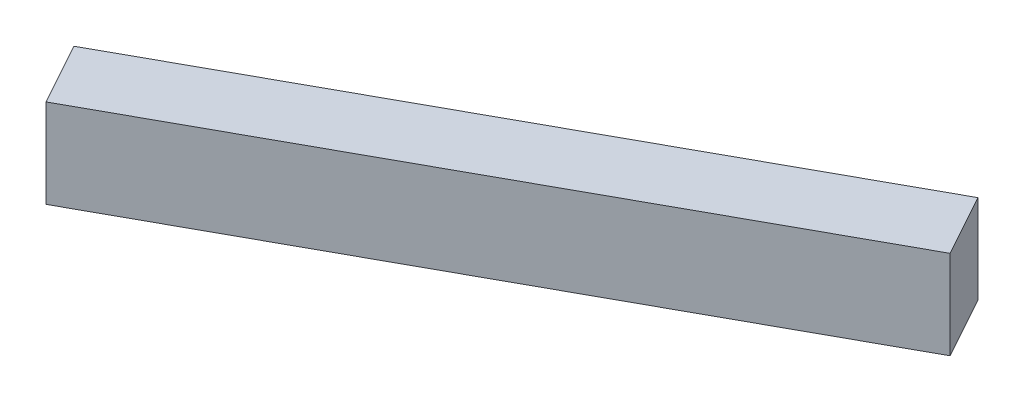
ISO-10303-21;
HEADER;
FILE_DESCRIPTION(('STEP AP214'),'2;1');
FILE_NAME('part.step','',(''),(''),'','','');
FILE_SCHEMA(('AUTOMOTIVE_DESIGN { 1 0 10303 214 1 1 1 1 }'));
ENDSEC;
DATA;
#1=APPLICATION_CONTEXT('core data for automotive mechanical design processes');
#2=APPLICATION_PROTOCOL_DEFINITION('international standard','automotive_design',2000,#1);
#3=PRODUCT_CONTEXT('',#1,'mechanical');
#4=PRODUCT('Part','Part','',(#3));
#5=PRODUCT_RELATED_PRODUCT_CATEGORY('part','',(#4));
#6=PRODUCT_DEFINITION_FORMATION('','',#4);
#7=PRODUCT_DEFINITION_CONTEXT('part definition',#1,'design');
#8=PRODUCT_DEFINITION('design','',#6,#7);
#9=PRODUCT_DEFINITION_SHAPE('','',#8);
#10=(LENGTH_UNIT() NAMED_UNIT(*) SI_UNIT(.MILLI.,.METRE.));
#11=(NAMED_UNIT(*) PLANE_ANGLE_UNIT() SI_UNIT($,.RADIAN.));
#12=(NAMED_UNIT(*) SI_UNIT($,.STERADIAN.) SOLID_ANGLE_UNIT());
#13=UNCERTAINTY_MEASURE_WITH_UNIT(LENGTH_MEASURE(1.E-05),#10,'distance_accuracy_value','');
#14=(GEOMETRIC_REPRESENTATION_CONTEXT(3) GLOBAL_UNCERTAINTY_ASSIGNED_CONTEXT((#13)) GLOBAL_UNIT_ASSIGNED_CONTEXT((#10,
#11,#12)) REPRESENTATION_CONTEXT('',''));
#15=CARTESIAN_POINT('',(0.,0.,0.));
#16=DIRECTION('',(0.,0.,1.));
#17=DIRECTION('',(1.,0.,0.));
#18=AXIS2_PLACEMENT_3D('',#15,#16,#17);
#19=CARTESIAN_POINT('',(-15.7186143391683,7.874,8.7646077133064));
#20=DIRECTION('',(-0.482079922020078,0.,-0.876127244631233));
#21=DIRECTION('',(-0.876127244631233,0.,0.482079922020078));
#22=AXIS2_PLACEMENT_3D('',#19,#20,#21);
#23=PLANE('',#22);
#24=DIRECTION('',(0.,1.,0.));
#25=VECTOR('',#24,1.);
#26=CARTESIAN_POINT('',(-15.7186143391683,7.874,8.7646077133064));
#27=LINE('',#26,#25);
#28=CARTESIAN_POINT('',(-15.7186143391683,7.62,8.7646077133064));
#29=VERTEX_POINT('',#28);
#30=CARTESIAN_POINT('',(-15.7186143391683,7.874,8.7646077133064));
#31=VERTEX_POINT('',#30);
#32=EDGE_CURVE('E20',#29,#31,#27,.T.);
#33=ORIENTED_EDGE('',*,*,#32,.T.);
#34=DIRECTION('',(-0.876127244631233,0.,0.482079922020078));
#35=VECTOR('',#34,1.);
#36=CARTESIAN_POINT('',(-15.7186143391683,7.874,8.7646077133064));
#37=LINE('',#36,#35);
#38=CARTESIAN_POINT('',(-17.3876367401908,7.874,9.68296996475465));
#39=VERTEX_POINT('',#38);
#40=EDGE_CURVE('E55',#31,#39,#37,.T.);
#41=ORIENTED_EDGE('',*,*,#40,.T.);
#42=DIRECTION('',(0.,1.,0.));
#43=VECTOR('',#42,1.);
#44=CARTESIAN_POINT('',(-17.3876367401908,7.874,9.68296996475465));
#45=LINE('',#44,#43);
#46=CARTESIAN_POINT('',(-17.3876367401908,7.62,9.68296996475465));
#47=VERTEX_POINT('',#46);
#48=EDGE_CURVE('E76',#39,#47,#45,.F.);
#49=ORIENTED_EDGE('',*,*,#48,.T.);
#50=DIRECTION('',(-0.876127244631233,0.,0.482079922020078));
#51=VECTOR('',#50,1.);
#52=CARTESIAN_POINT('',(-15.7186143391683,7.62,8.7646077133064));
#53=LINE('',#52,#51);
#54=EDGE_CURVE('E58',#29,#47,#53,.T.);
#55=ORIENTED_EDGE('',*,*,#54,.F.);
#56=EDGE_LOOP('',(#33,#41,#49,#55));
#57=FACE_BOUND('',#56,.T.);
#58=ADVANCED_FACE('F17',(#57),#23,.F.);
#59=CARTESIAN_POINT('',(-15.7186143391683,7.874,8.7646077133064));
#60=DIRECTION('',(-0.876127244631218,0.,0.482079922020105));
#61=DIRECTION('',(0.482079922020105,0.,0.876127244631218));
#62=AXIS2_PLACEMENT_3D('',#59,#60,#61);
#63=PLANE('',#62);
#64=DIRECTION('',(0.,1.,0.));
#65=VECTOR('',#64,1.);
#66=CARTESIAN_POINT('',(-15.8165729793228,7.874,8.58657865719733));
#67=LINE('',#66,#65);
#68=CARTESIAN_POINT('',(-15.8165729793228,7.62,8.58657865719733));
#69=VERTEX_POINT('',#68);
#70=CARTESIAN_POINT('',(-15.8165729793228,7.874,8.58657865719733));
#71=VERTEX_POINT('',#70);
#72=EDGE_CURVE('E73',#69,#71,#67,.T.);
#73=ORIENTED_EDGE('',*,*,#72,.T.);
#74=DIRECTION('',(0.48207992202015,0.,0.876127244631193));
#75=VECTOR('',#74,1.);
#76=CARTESIAN_POINT('',(-15.8165729793228,7.874,8.58657865719733));
#77=LINE('',#76,#75);
#78=EDGE_CURVE('E63',#71,#31,#77,.T.);
#79=ORIENTED_EDGE('',*,*,#78,.T.);
#80=ORIENTED_EDGE('',*,*,#32,.F.);
#81=DIRECTION('',(0.48207992202015,0.,0.876127244631193));
#82=VECTOR('',#81,1.);
#83=CARTESIAN_POINT('',(-15.8165729793228,7.62,8.58657865719733));
#84=LINE('',#83,#82);
#85=EDGE_CURVE('E80',#69,#29,#84,.T.);
#86=ORIENTED_EDGE('',*,*,#85,.F.);
#87=EDGE_LOOP('',(#73,#79,#80,#86));
#88=FACE_BOUND('',#87,.T.);
#89=ADVANCED_FACE('F72',(#88),#63,.F.);
#90=CARTESIAN_POINT('',(-15.7186143391683,7.874,8.7646077133064));
#91=DIRECTION('',(0.,-1.,0.));
#92=DIRECTION('',(0.,0.,-1.));
#93=AXIS2_PLACEMENT_3D('',#90,#91,#92);
#94=PLANE('',#93);
#95=ORIENTED_EDGE('',*,*,#78,.F.);
#96=DIRECTION('',(0.876127244631232,0.,-0.482079922020079));
#97=VECTOR('',#96,1.);
#98=CARTESIAN_POINT('',(-15.8165729793228,7.874,8.58657865719733));
#99=LINE('',#98,#97);
#100=CARTESIAN_POINT('',(-17.4855953806163,7.874,9.5049409087947));
#101=VERTEX_POINT('',#100);
#102=EDGE_CURVE('E83',#71,#101,#99,.F.);
#103=ORIENTED_EDGE('',*,*,#102,.T.);
#104=DIRECTION('',(-0.482079923353831,0.,-0.876127243897349));
#105=VECTOR('',#104,1.);
#106=CARTESIAN_POINT('',(-17.3876367401908,7.874,9.68296996475465));
#107=LINE('',#106,#105);
#108=EDGE_CURVE('E69',#101,#39,#107,.F.);
#109=ORIENTED_EDGE('',*,*,#108,.T.);
#110=ORIENTED_EDGE('',*,*,#40,.F.);
#111=EDGE_LOOP('',(#95,#103,#109,#110));
#112=FACE_BOUND('',#111,.T.);
#113=ADVANCED_FACE('F66',(#112),#94,.F.);
#114=CARTESIAN_POINT('',(-17.3876367401908,7.874,9.68296996475465));
#115=DIRECTION('',(0.876127243897349,0.,-0.482079923353831));
#116=DIRECTION('',(-0.482079923353831,0.,-0.876127243897349));
#117=AXIS2_PLACEMENT_3D('',#114,#115,#116);
#118=PLANE('',#117);
#119=ORIENTED_EDGE('',*,*,#48,.F.);
#120=ORIENTED_EDGE('',*,*,#108,.F.);
#121=DIRECTION('',(0.,1.,0.));
#122=VECTOR('',#121,1.);
#123=CARTESIAN_POINT('',(-17.4855953806163,7.874,9.5049409087947));
#124=LINE('',#123,#122);
#125=CARTESIAN_POINT('',(-17.4855953806163,7.62,9.5049409087947));
#126=VERTEX_POINT('',#125);
#127=EDGE_CURVE('E26',#101,#126,#124,.F.);
#128=ORIENTED_EDGE('',*,*,#127,.T.);
#129=DIRECTION('',(-0.482079923353817,0.,-0.876127243897356));
#130=VECTOR('',#129,1.);
#131=CARTESIAN_POINT('',(-17.3876367401908,7.62,9.68296996475465));
#132=LINE('',#131,#130);
#133=EDGE_CURVE('E34',#47,#126,#132,.T.);
#134=ORIENTED_EDGE('',*,*,#133,.F.);
#135=EDGE_LOOP('',(#119,#120,#128,#134));
#136=FACE_BOUND('',#135,.T.);
#137=ADVANCED_FACE('F88',(#136),#118,.F.);
#138=CARTESIAN_POINT('',(-15.7186143391683,7.62,8.7646077133064));
#139=DIRECTION('',(0.,-1.,0.));
#140=DIRECTION('',(0.,0.,-1.));
#141=AXIS2_PLACEMENT_3D('',#138,#139,#140);
#142=PLANE('',#141);
#143=DIRECTION('',(0.876127244631232,0.,-0.482079922020079));
#144=VECTOR('',#143,1.);
#145=CARTESIAN_POINT('',(-15.8165729793228,7.62,8.58657865719733));
#146=LINE('',#145,#144);
#147=EDGE_CURVE('E11',#126,#69,#146,.T.);
#148=ORIENTED_EDGE('',*,*,#147,.T.);
#149=ORIENTED_EDGE('',*,*,#85,.T.);
#150=ORIENTED_EDGE('',*,*,#54,.T.);
#151=ORIENTED_EDGE('',*,*,#133,.T.);
#152=EDGE_LOOP('',(#148,#149,#150,#151));
#153=FACE_BOUND('',#152,.T.);
#154=ADVANCED_FACE('F91',(#153),#142,.T.);
#155=CARTESIAN_POINT('',(-15.8165729793228,7.874,8.58657865719733));
#156=DIRECTION('',(0.482079922020079,0.,0.876127244631232));
#157=DIRECTION('',(0.876127244631232,0.,-0.482079922020079));
#158=AXIS2_PLACEMENT_3D('',#155,#156,#157);
#159=PLANE('',#158);
#160=ORIENTED_EDGE('',*,*,#127,.F.);
#161=ORIENTED_EDGE('',*,*,#102,.F.);
#162=ORIENTED_EDGE('',*,*,#72,.F.);
#163=ORIENTED_EDGE('',*,*,#147,.F.);
#164=EDGE_LOOP('',(#160,#161,#162,#163));
#165=FACE_BOUND('',#164,.T.);
#166=ADVANCED_FACE('F90',(#165),#159,.F.);
#167=CLOSED_SHELL('',(#58,#89,#113,#137,#154,#166));
#168=MANIFOLD_SOLID_BREP('B1',#167);
#169=ADVANCED_BREP_SHAPE_REPRESENTATION('',(#18,#168),#14);
#170=SHAPE_DEFINITION_REPRESENTATION(#9,#169);
ENDSEC;
END-ISO-10303-21;
